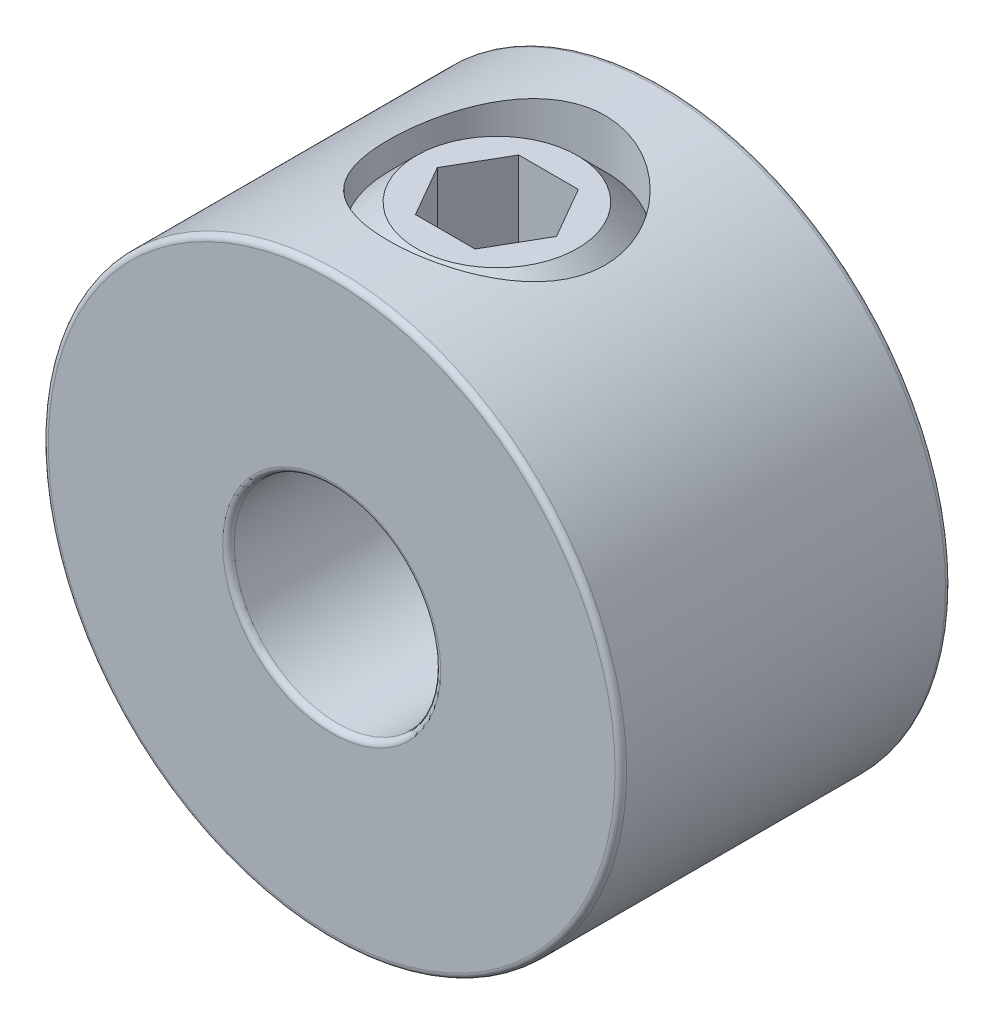
ISO-10303-21;
HEADER;
FILE_DESCRIPTION(('STEP AP214'),'2;1');
FILE_NAME('part.step','',(''),(''),'','','');
FILE_SCHEMA(('AUTOMOTIVE_DESIGN { 1 0 10303 214 1 1 1 1 }'));
ENDSEC;
DATA;
#1=APPLICATION_CONTEXT('core data for automotive mechanical design processes');
#2=APPLICATION_PROTOCOL_DEFINITION('international standard','automotive_design',2000,#1);
#3=PRODUCT_CONTEXT('',#1,'mechanical');
#4=PRODUCT('Part','Part','',(#3));
#5=PRODUCT_RELATED_PRODUCT_CATEGORY('part','',(#4));
#6=PRODUCT_DEFINITION_FORMATION('','',#4);
#7=PRODUCT_DEFINITION_CONTEXT('part definition',#1,'design');
#8=PRODUCT_DEFINITION('design','',#6,#7);
#9=PRODUCT_DEFINITION_SHAPE('','',#8);
#10=(LENGTH_UNIT() NAMED_UNIT(*) SI_UNIT(.MILLI.,.METRE.));
#11=(NAMED_UNIT(*) PLANE_ANGLE_UNIT() SI_UNIT($,.RADIAN.));
#12=(NAMED_UNIT(*) SI_UNIT($,.STERADIAN.) SOLID_ANGLE_UNIT());
#13=UNCERTAINTY_MEASURE_WITH_UNIT(LENGTH_MEASURE(1.E-05),#10,'distance_accuracy_value','');
#14=(GEOMETRIC_REPRESENTATION_CONTEXT(3) GLOBAL_UNCERTAINTY_ASSIGNED_CONTEXT((#13)) GLOBAL_UNIT_ASSIGNED_CONTEXT((#10,
#11,#12)) REPRESENTATION_CONTEXT('',''));
#15=CARTESIAN_POINT('',(0.,0.,0.));
#16=DIRECTION('',(0.,0.,1.));
#17=DIRECTION('',(1.,0.,0.));
#18=AXIS2_PLACEMENT_3D('',#15,#16,#17);
#19=CARTESIAN_POINT('',(0.,5.159375,0.));
#20=DIRECTION('',(0.,1.,0.));
#21=DIRECTION('',(-1.,0.,0.));
#22=AXIS2_PLACEMENT_3D('',#19,#20,#21);
#23=PLANE('',#22);
#24=CARTESIAN_POINT('',(0.,5.159375,0.));
#25=DIRECTION('',(0.,1.,0.));
#26=DIRECTION('',(-1.,0.,0.));
#27=AXIS2_PLACEMENT_3D('',#24,#25,#26);
#28=CIRCLE('',#27,1.54730253738467);
#29=CARTESIAN_POINT('',(-1.54730253738467,5.159375,0.));
#30=VERTEX_POINT('',#29);
#31=EDGE_CURVE('E12',#30,#30,#28,.T.);
#32=ORIENTED_EDGE('',*,*,#31,.T.);
#33=EDGE_LOOP('',(#32));
#34=FACE_BOUND('',#33,.T.);
#35=DIRECTION('',(1.,0.,0.));
#36=VECTOR('',#35,1.);
#37=CARTESIAN_POINT('',(-0.572839720211582,5.15937499999999,-0.992187499999998));
#38=LINE('',#37,#36);
#39=CARTESIAN_POINT('',(-0.572839720211582,5.15937499999999,-0.992187499999998));
#40=VERTEX_POINT('',#39);
#41=CARTESIAN_POINT('',(0.572839720211582,5.159375,-0.992187499999998));
#42=VERTEX_POINT('',#41);
#43=EDGE_CURVE('E112',#40,#42,#38,.T.);
#44=ORIENTED_EDGE('',*,*,#43,.T.);
#45=DIRECTION('',(0.5,0.,0.866025403784438));
#46=VECTOR('',#45,1.);
#47=CARTESIAN_POINT('',(0.572839720211582,5.15937499999999,-0.992187499999998));
#48=LINE('',#47,#46);
#49=CARTESIAN_POINT('',(1.14567944042316,5.15937499999999,0.));
#50=VERTEX_POINT('',#49);
#51=EDGE_CURVE('E58',#42,#50,#48,.T.);
#52=ORIENTED_EDGE('',*,*,#51,.T.);
#53=DIRECTION('',(-0.5,0.,0.866025403784439));
#54=VECTOR('',#53,1.);
#55=CARTESIAN_POINT('',(1.14567944042316,5.15937499999999,0.));
#56=LINE('',#55,#54);
#57=CARTESIAN_POINT('',(0.572839720211582,5.15937499999999,0.992187500000003));
#58=VERTEX_POINT('',#57);
#59=EDGE_CURVE('E116',#50,#58,#56,.T.);
#60=ORIENTED_EDGE('',*,*,#59,.T.);
#61=DIRECTION('',(-1.,0.,0.));
#62=VECTOR('',#61,1.);
#63=CARTESIAN_POINT('',(0.572839720211582,5.15937499999999,0.992187500000003));
#64=LINE('',#63,#62);
#65=CARTESIAN_POINT('',(-0.572839720211583,5.15937499999999,0.992187500000003));
#66=VERTEX_POINT('',#65);
#67=EDGE_CURVE('E179',#58,#66,#64,.T.);
#68=ORIENTED_EDGE('',*,*,#67,.T.);
#69=DIRECTION('',(-0.5,0.,-0.866025403784438));
#70=VECTOR('',#69,1.);
#71=CARTESIAN_POINT('',(-0.572839720211583,5.15937499999999,0.992187500000003));
#72=LINE('',#71,#70);
#73=CARTESIAN_POINT('',(-1.14567944042316,5.15937499999999,0.));
#74=VERTEX_POINT('',#73);
#75=EDGE_CURVE('E164',#66,#74,#72,.T.);
#76=ORIENTED_EDGE('',*,*,#75,.T.);
#77=DIRECTION('',(0.5,0.,-0.866025403784439));
#78=VECTOR('',#77,1.);
#79=CARTESIAN_POINT('',(-1.14567944042316,5.15937499999999,0.));
#80=LINE('',#79,#78);
#81=EDGE_CURVE('E160',#74,#40,#80,.T.);
#82=ORIENTED_EDGE('',*,*,#81,.T.);
#83=EDGE_LOOP('',(#44,#52,#60,#68,#76,#82));
#84=FACE_BOUND('',#83,.T.);
#85=ADVANCED_FACE('F44',(#34,#84),#23,.T.);
#86=CARTESIAN_POINT('',(0.,5.159375,0.));
#87=DIRECTION('',(0.,-1.,0.));
#88=DIRECTION('',(1.,0.,0.));
#89=AXIS2_PLACEMENT_3D('',#86,#87,#88);
#90=CONICAL_SURFACE('',#89,1.54730253738467,0.785398163397448);
#91=CARTESIAN_POINT('',(0.,4.62387753738467,0.));
#92=DIRECTION('',(0.,1.,0.));
#93=DIRECTION('',(-1.,0.,0.));
#94=AXIS2_PLACEMENT_3D('',#91,#92,#93);
#95=CIRCLE('',#94,2.0828);
#96=CARTESIAN_POINT('',(-2.0828,4.62387753738467,0.));
#97=VERTEX_POINT('',#96);
#98=EDGE_CURVE('E51',#97,#97,#95,.T.);
#99=ORIENTED_EDGE('',*,*,#98,.T.);
#100=EDGE_LOOP('',(#99));
#101=FACE_BOUND('',#100,.T.);
#102=ORIENTED_EDGE('',*,*,#31,.F.);
#103=EDGE_LOOP('',(#102));
#104=FACE_BOUND('',#103,.T.);
#105=ADVANCED_FACE('F134',(#101,#104),#90,.T.);
#106=CARTESIAN_POINT('',(0.,1.984375,0.));
#107=DIRECTION('',(0.,1.,0.));
#108=DIRECTION('',(-1.,0.,0.));
#109=AXIS2_PLACEMENT_3D('',#106,#107,#108);
#110=CYLINDRICAL_SURFACE('',#109,2.0828);
#111=CARTESIAN_POINT('',(0.,2.51987246261534,0.));
#112=DIRECTION('',(0.,1.,0.));
#113=DIRECTION('',(-1.,0.,0.));
#114=AXIS2_PLACEMENT_3D('',#111,#112,#113);
#115=CIRCLE('',#114,2.0828);
#116=CARTESIAN_POINT('',(-2.0828,2.51987246261534,0.));
#117=VERTEX_POINT('',#116);
#118=EDGE_CURVE('E129',#117,#117,#115,.T.);
#119=ORIENTED_EDGE('',*,*,#118,.T.);
#120=EDGE_LOOP('',(#119));
#121=FACE_BOUND('',#120,.T.);
#122=ORIENTED_EDGE('',*,*,#98,.F.);
#123=EDGE_LOOP('',(#122));
#124=FACE_BOUND('',#123,.T.);
#125=ADVANCED_FACE('F137',(#121,#124),#110,.T.);
#126=CARTESIAN_POINT('',(0.,2.51987246261534,0.));
#127=DIRECTION('',(0.,1.,0.));
#128=DIRECTION('',(-1.,0.,0.));
#129=AXIS2_PLACEMENT_3D('',#126,#127,#128);
#130=CONICAL_SURFACE('',#129,2.0828,0.785398163397448);
#131=CARTESIAN_POINT('',(0.,1.984375,0.));
#132=DIRECTION('',(0.,1.,0.));
#133=DIRECTION('',(-1.,0.,0.));
#134=AXIS2_PLACEMENT_3D('',#131,#132,#133);
#135=CIRCLE('',#134,1.54730253738467);
#136=CARTESIAN_POINT('',(-1.54730253738467,1.984375,0.));
#137=VERTEX_POINT('',#136);
#138=EDGE_CURVE('E121',#137,#137,#135,.T.);
#139=ORIENTED_EDGE('',*,*,#138,.T.);
#140=EDGE_LOOP('',(#139));
#141=FACE_BOUND('',#140,.T.);
#142=ORIENTED_EDGE('',*,*,#118,.F.);
#143=EDGE_LOOP('',(#142));
#144=FACE_BOUND('',#143,.T.);
#145=ADVANCED_FACE('F139',(#141,#144),#130,.T.);
#146=CARTESIAN_POINT('',(-1.54730253738467,1.984375,0.));
#147=DIRECTION('',(0.,-1.,0.));
#148=DIRECTION('',(1.,0.,0.));
#149=AXIS2_PLACEMENT_3D('',#146,#147,#148);
#150=PLANE('',#149);
#151=CARTESIAN_POINT('',(0.,1.984375,0.));
#152=DIRECTION('',(0.,1.,0.));
#153=DIRECTION('',(-1.,0.,0.));
#154=AXIS2_PLACEMENT_3D('',#151,#152,#153);
#155=CIRCLE('',#154,0.642596955138402);
#156=CARTESIAN_POINT('',(-0.642596955138402,1.984375,0.));
#157=VERTEX_POINT('',#156);
#158=EDGE_CURVE('E117',#157,#157,#155,.T.);
#159=ORIENTED_EDGE('',*,*,#158,.T.);
#160=EDGE_LOOP('',(#159));
#161=FACE_BOUND('',#160,.T.);
#162=ORIENTED_EDGE('',*,*,#138,.F.);
#163=EDGE_LOOP('',(#162));
#164=FACE_BOUND('',#163,.T.);
#165=ADVANCED_FACE('F146',(#161,#164),#150,.T.);
#166=CARTESIAN_POINT('',(0.,1.984375,0.));
#167=DIRECTION('',(0.,-1.,0.));
#168=DIRECTION('',(1.,0.,0.));
#169=AXIS2_PLACEMENT_3D('',#166,#167,#168);
#170=CONICAL_SURFACE('',#169,0.642596955138402,0.785398163397448);
#171=CARTESIAN_POINT('',(0.,2.6269719551384,0.));
#172=VERTEX_POINT('',#171);
#173=VERTEX_LOOP('',#172);
#174=FACE_BOUND('',#173,.T.);
#175=ORIENTED_EDGE('',*,*,#158,.F.);
#176=EDGE_LOOP('',(#175));
#177=FACE_BOUND('',#176,.T.);
#178=ADVANCED_FACE('F213',(#174,#177),#170,.F.);
#179=CARTESIAN_POINT('',(0.572839720211582,3.17499999999999,-0.992187499999998));
#180=DIRECTION('',(-0.866025403784438,0.,0.5));
#181=DIRECTION('',(0.5,0.,0.866025403784439));
#182=AXIS2_PLACEMENT_3D('',#179,#180,#181);
#183=PLANE('',#182);
#184=ORIENTED_EDGE('',*,*,#51,.F.);
#185=DIRECTION('',(0.,1.,0.));
#186=VECTOR('',#185,1.);
#187=CARTESIAN_POINT('',(0.572839720211582,3.17499999999999,-0.992187499999998));
#188=LINE('',#187,#186);
#189=CARTESIAN_POINT('',(0.572839720211582,3.17499999999999,-0.992187499999998));
#190=VERTEX_POINT('',#189);
#191=EDGE_CURVE('E111',#190,#42,#188,.T.);
#192=ORIENTED_EDGE('',*,*,#191,.F.);
#193=DIRECTION('',(0.5,0.,0.866025403784438));
#194=VECTOR('',#193,1.);
#195=CARTESIAN_POINT('',(0.572839720211582,3.17499999999999,-0.992187499999998));
#196=LINE('',#195,#194);
#197=CARTESIAN_POINT('',(1.14567944042316,3.17499999999999,0.));
#198=VERTEX_POINT('',#197);
#199=EDGE_CURVE('E102',#190,#198,#196,.T.);
#200=ORIENTED_EDGE('',*,*,#199,.T.);
#201=DIRECTION('',(0.,1.,0.));
#202=VECTOR('',#201,1.);
#203=CARTESIAN_POINT('',(1.14567944042316,3.17499999999999,0.));
#204=LINE('',#203,#202);
#205=EDGE_CURVE('E110',#198,#50,#204,.T.);
#206=ORIENTED_EDGE('',*,*,#205,.T.);
#207=EDGE_LOOP('',(#184,#192,#200,#206));
#208=FACE_BOUND('',#207,.T.);
#209=ADVANCED_FACE('F109',(#208),#183,.T.);
#210=CARTESIAN_POINT('',(1.14567944042316,3.17499999999999,0.));
#211=DIRECTION('',(-0.866025403784439,0.,-0.499999999999999));
#212=DIRECTION('',(-0.5,0.,0.866025403784439));
#213=AXIS2_PLACEMENT_3D('',#210,#211,#212);
#214=PLANE('',#213);
#215=ORIENTED_EDGE('',*,*,#59,.F.);
#216=ORIENTED_EDGE('',*,*,#205,.F.);
#217=DIRECTION('',(-0.5,0.,0.866025403784439));
#218=VECTOR('',#217,1.);
#219=CARTESIAN_POINT('',(1.14567944042316,3.17499999999999,0.));
#220=LINE('',#219,#218);
#221=CARTESIAN_POINT('',(0.572839720211582,3.17499999999999,0.992187500000003));
#222=VERTEX_POINT('',#221);
#223=EDGE_CURVE('E98',#198,#222,#220,.T.);
#224=ORIENTED_EDGE('',*,*,#223,.T.);
#225=DIRECTION('',(0.,1.,0.));
#226=VECTOR('',#225,1.);
#227=CARTESIAN_POINT('',(0.572839720211582,3.17499999999999,0.992187500000003));
#228=LINE('',#227,#226);
#229=EDGE_CURVE('E118',#222,#58,#228,.T.);
#230=ORIENTED_EDGE('',*,*,#229,.T.);
#231=EDGE_LOOP('',(#215,#216,#224,#230));
#232=FACE_BOUND('',#231,.T.);
#233=ADVANCED_FACE('F114',(#232),#214,.T.);
#234=CARTESIAN_POINT('',(0.572839720211582,3.17499999999999,0.992187500000003));
#235=DIRECTION('',(0.,0.,-1.));
#236=DIRECTION('',(-1.,0.,0.));
#237=AXIS2_PLACEMENT_3D('',#234,#235,#236);
#238=PLANE('',#237);
#239=ORIENTED_EDGE('',*,*,#67,.F.);
#240=ORIENTED_EDGE('',*,*,#229,.F.);
#241=DIRECTION('',(-1.,0.,0.));
#242=VECTOR('',#241,1.);
#243=CARTESIAN_POINT('',(0.572839720211582,3.17499999999999,0.992187500000003));
#244=LINE('',#243,#242);
#245=CARTESIAN_POINT('',(-0.572839720211583,3.17499999999999,0.992187500000003));
#246=VERTEX_POINT('',#245);
#247=EDGE_CURVE('E104',#222,#246,#244,.T.);
#248=ORIENTED_EDGE('',*,*,#247,.T.);
#249=DIRECTION('',(0.,1.,0.));
#250=VECTOR('',#249,1.);
#251=CARTESIAN_POINT('',(-0.572839720211583,3.17499999999999,0.992187500000003));
#252=LINE('',#251,#250);
#253=EDGE_CURVE('E123',#246,#66,#252,.T.);
#254=ORIENTED_EDGE('',*,*,#253,.T.);
#255=EDGE_LOOP('',(#239,#240,#248,#254));
#256=FACE_BOUND('',#255,.T.);
#257=ADVANCED_FACE('F177',(#256),#238,.T.);
#258=CARTESIAN_POINT('',(-0.572839720211583,3.17499999999999,0.992187500000003));
#259=DIRECTION('',(0.866025403784438,0.,-0.5));
#260=DIRECTION('',(-0.5,0.,-0.866025403784439));
#261=AXIS2_PLACEMENT_3D('',#258,#259,#260);
#262=PLANE('',#261);
#263=ORIENTED_EDGE('',*,*,#75,.F.);
#264=ORIENTED_EDGE('',*,*,#253,.F.);
#265=DIRECTION('',(-0.5,0.,-0.866025403784438));
#266=VECTOR('',#265,1.);
#267=CARTESIAN_POINT('',(-0.572839720211583,3.17499999999999,0.992187500000003));
#268=LINE('',#267,#266);
#269=CARTESIAN_POINT('',(-1.14567944042316,3.17499999999999,0.));
#270=VERTEX_POINT('',#269);
#271=EDGE_CURVE('E190',#246,#270,#268,.T.);
#272=ORIENTED_EDGE('',*,*,#271,.T.);
#273=DIRECTION('',(0.,1.,0.));
#274=VECTOR('',#273,1.);
#275=CARTESIAN_POINT('',(-1.14567944042316,3.17499999999999,0.));
#276=LINE('',#275,#274);
#277=EDGE_CURVE('E172',#270,#74,#276,.T.);
#278=ORIENTED_EDGE('',*,*,#277,.T.);
#279=EDGE_LOOP('',(#263,#264,#272,#278));
#280=FACE_BOUND('',#279,.T.);
#281=ADVANCED_FACE('F181',(#280),#262,.T.);
#282=CARTESIAN_POINT('',(-1.14567944042316,3.17499999999999,0.));
#283=DIRECTION('',(0.866025403784439,0.,0.5));
#284=DIRECTION('',(0.5,0.,-0.866025403784439));
#285=AXIS2_PLACEMENT_3D('',#282,#283,#284);
#286=PLANE('',#285);
#287=ORIENTED_EDGE('',*,*,#81,.F.);
#288=ORIENTED_EDGE('',*,*,#277,.F.);
#289=DIRECTION('',(0.5,0.,-0.866025403784439));
#290=VECTOR('',#289,1.);
#291=CARTESIAN_POINT('',(-1.14567944042316,3.17499999999999,0.));
#292=LINE('',#291,#290);
#293=CARTESIAN_POINT('',(-0.572839720211582,3.17499999999999,-0.992187499999998));
#294=VERTEX_POINT('',#293);
#295=EDGE_CURVE('E188',#270,#294,#292,.T.);
#296=ORIENTED_EDGE('',*,*,#295,.T.);
#297=DIRECTION('',(0.,1.,0.));
#298=VECTOR('',#297,1.);
#299=CARTESIAN_POINT('',(-0.572839720211582,3.17499999999999,-0.992187499999998));
#300=LINE('',#299,#298);
#301=EDGE_CURVE('E169',#294,#40,#300,.T.);
#302=ORIENTED_EDGE('',*,*,#301,.T.);
#303=EDGE_LOOP('',(#287,#288,#296,#302));
#304=FACE_BOUND('',#303,.T.);
#305=ADVANCED_FACE('F194',(#304),#286,.T.);
#306=CARTESIAN_POINT('',(-0.572839720211582,3.17499999999999,-0.992187499999998));
#307=DIRECTION('',(0.,0.,1.));
#308=DIRECTION('',(1.,0.,0.));
#309=AXIS2_PLACEMENT_3D('',#306,#307,#308);
#310=PLANE('',#309);
#311=ORIENTED_EDGE('',*,*,#43,.F.);
#312=ORIENTED_EDGE('',*,*,#301,.F.);
#313=DIRECTION('',(1.,0.,0.));
#314=VECTOR('',#313,1.);
#315=CARTESIAN_POINT('',(-0.572839720211582,3.17499999999999,-0.992187499999998));
#316=LINE('',#315,#314);
#317=EDGE_CURVE('E170',#294,#190,#316,.T.);
#318=ORIENTED_EDGE('',*,*,#317,.T.);
#319=ORIENTED_EDGE('',*,*,#191,.T.);
#320=EDGE_LOOP('',(#311,#312,#318,#319));
#321=FACE_BOUND('',#320,.T.);
#322=ADVANCED_FACE('F195',(#321),#310,.T.);
#323=CARTESIAN_POINT('',(0.,3.17499999999999,-1.984375));
#324=DIRECTION('',(0.,1.,0.));
#325=DIRECTION('',(0.,0.,1.));
#326=AXIS2_PLACEMENT_3D('',#323,#324,#325);
#327=PLANE('',#326);
#328=ORIENTED_EDGE('',*,*,#199,.F.);
#329=ORIENTED_EDGE('',*,*,#317,.F.);
#330=ORIENTED_EDGE('',*,*,#295,.F.);
#331=ORIENTED_EDGE('',*,*,#271,.F.);
#332=ORIENTED_EDGE('',*,*,#247,.F.);
#333=ORIENTED_EDGE('',*,*,#223,.F.);
#334=EDGE_LOOP('',(#328,#329,#330,#331,#332,#333));
#335=FACE_BOUND('',#334,.T.);
#336=ADVANCED_FACE('F100',(#335),#327,.T.);
#337=CLOSED_SHELL('',(#85,#105,#125,#145,#165,#178,#209,#233,#257,#281,#305,#322,#336));
#338=MANIFOLD_SOLID_BREP('B2',#337);
#339=CARTESIAN_POINT('',(0.,0.,3.175));
#340=DIRECTION('',(0.,0.,1.));
#341=DIRECTION('',(1.,0.,0.));
#342=AXIS2_PLACEMENT_3D('',#339,#340,#341);
#343=PLANE('',#342);
#344=CARTESIAN_POINT('',(0.,0.,3.175));
#345=DIRECTION('',(0.,0.,1.));
#346=DIRECTION('',(1.,0.,0.));
#347=AXIS2_PLACEMENT_3D('',#344,#345,#346);
#348=CIRCLE('',#347,2.0955);
#349=CARTESIAN_POINT('',(2.0955,0.,3.175));
#350=VERTEX_POINT('',#349);
#351=EDGE_CURVE('E397',#350,#350,#348,.F.);
#352=ORIENTED_EDGE('',*,*,#351,.T.);
#353=EDGE_LOOP('',(#352));
#354=FACE_BOUND('',#353,.T.);
#355=CARTESIAN_POINT('',(0.,0.,3.175));
#356=DIRECTION('',(0.,0.,1.));
#357=DIRECTION('',(1.,0.,0.));
#358=AXIS2_PLACEMENT_3D('',#355,#356,#357);
#359=CIRCLE('',#358,5.445125);
#360=CARTESIAN_POINT('',(5.445125,0.,3.175));
#361=VERTEX_POINT('',#360);
#362=EDGE_CURVE('E400',#361,#361,#359,.T.);
#363=ORIENTED_EDGE('',*,*,#362,.T.);
#364=EDGE_LOOP('',(#363));
#365=FACE_BOUND('',#364,.T.);
#366=ADVANCED_FACE('F298',(#354,#365),#343,.T.);
#367=CARTESIAN_POINT('',(0.,0.,-3.175));
#368=DIRECTION('',(0.,0.,1.));
#369=DIRECTION('',(1.,0.,0.));
#370=AXIS2_PLACEMENT_3D('',#367,#368,#369);
#371=PLANE('',#370);
#372=CARTESIAN_POINT('',(0.,0.,-3.175));
#373=DIRECTION('',(0.,0.,1.));
#374=DIRECTION('',(1.,0.,0.));
#375=AXIS2_PLACEMENT_3D('',#372,#373,#374);
#376=CIRCLE('',#375,2.0955);
#377=CARTESIAN_POINT('',(2.0955,0.,-3.175));
#378=VERTEX_POINT('',#377);
#379=EDGE_CURVE('E416',#378,#378,#376,.T.);
#380=ORIENTED_EDGE('',*,*,#379,.T.);
#381=EDGE_LOOP('',(#380));
#382=FACE_BOUND('',#381,.T.);
#383=CARTESIAN_POINT('',(0.,0.,-3.175));
#384=DIRECTION('',(0.,0.,1.));
#385=DIRECTION('',(1.,0.,0.));
#386=AXIS2_PLACEMENT_3D('',#383,#384,#385);
#387=CIRCLE('',#386,5.445125);
#388=CARTESIAN_POINT('',(5.445125,0.,-3.175));
#389=VERTEX_POINT('',#388);
#390=EDGE_CURVE('E419',#389,#389,#387,.F.);
#391=ORIENTED_EDGE('',*,*,#390,.T.);
#392=EDGE_LOOP('',(#391));
#393=FACE_BOUND('',#392,.T.);
#394=ADVANCED_FACE('F370',(#382,#393),#371,.F.);
#395=CARTESIAN_POINT('',(0.,0.,3.175));
#396=DIRECTION('',(0.,0.,-1.));
#397=DIRECTION('',(-1.,0.,0.));
#398=AXIS2_PLACEMENT_3D('',#395,#396,#397);
#399=CYLINDRICAL_SURFACE('',#398,5.55625);
#400=CARTESIAN_POINT('',(0.,0.,-3.063875));
#401=DIRECTION('',(0.,0.,1.));
#402=DIRECTION('',(1.,0.,0.));
#403=AXIS2_PLACEMENT_3D('',#400,#401,#402);
#404=CIRCLE('',#403,5.55625);
#405=CARTESIAN_POINT('',(5.55625,0.,-3.063875));
#406=VERTEX_POINT('',#405);
#407=EDGE_CURVE('E42',#406,#406,#404,.T.);
#408=ORIENTED_EDGE('',*,*,#407,.T.);
#409=EDGE_LOOP('',(#408));
#410=FACE_BOUND('',#409,.T.);
#411=CARTESIAN_POINT('',(0.,0.,3.063875));
#412=DIRECTION('',(0.,0.,1.));
#413=DIRECTION('',(1.,0.,0.));
#414=AXIS2_PLACEMENT_3D('',#411,#412,#413);
#415=CIRCLE('',#414,5.55625);
#416=CARTESIAN_POINT('',(5.55625,0.,3.063875));
#417=VERTEX_POINT('',#416);
#418=EDGE_CURVE('E306',#417,#417,#415,.F.);
#419=ORIENTED_EDGE('',*,*,#418,.T.);
#420=EDGE_LOOP('',(#419));
#421=FACE_BOUND('',#420,.T.);
#422=CARTESIAN_POINT('',(0.,5.55625,-2.0828));
#423=CARTESIAN_POINT('',(0.112800632930004,5.55625300768121,-2.08280401535049));
#424=CARTESIAN_POINT('',(0.22557375650504,5.55278505962081,-2.07360774080138));
#425=CARTESIAN_POINT('',(0.447749891057454,5.5392973200522,-2.03721439435715));
#426=CARTESIAN_POINT('',(0.55715338230433,5.5292784668036,-2.0100199002673));
#427=CARTESIAN_POINT('',(0.7693540019046,5.50376437690656,-1.93872693071781));
#428=CARTESIAN_POINT('',(0.872163424064122,5.48827970334317,-1.89466104660532));
#429=CARTESIAN_POINT('',(1.06892323856479,5.4533764248173,-1.79104186225435));
#430=CARTESIAN_POINT('',(1.16287124747356,5.43395676586827,-1.73148441138188));
#431=CARTESIAN_POINT('',(1.34322911463978,5.39226740506348,-1.59593235187956));
#432=CARTESIAN_POINT('',(1.42921302733438,5.36991708646606,-1.51939602956842));
#433=CARTESIAN_POINT('',(1.58746804313499,5.3252823776817,-1.35320883055734));
#434=CARTESIAN_POINT('',(1.65973495359077,5.30299800969504,-1.26355395890717));
#435=CARTESIAN_POINT('',(1.79121226481723,5.26008047465291,-1.06951383102155));
#436=CARTESIAN_POINT('',(1.84982111942716,5.23954242039672,-0.964697836024094));
#437=CARTESIAN_POINT('',(1.94838923392661,5.20369722833776,-0.745805447537557));
#438=CARTESIAN_POINT('',(1.98835593632194,5.18838800368424,-0.631732770982777));
#439=CARTESIAN_POINT('',(2.04682402169344,5.16559576084147,-0.402467790242334));
#440=CARTESIAN_POINT('',(2.06613822134155,5.15781763095547,-0.287513102391948));
#441=CARTESIAN_POINT('',(2.08529440426013,5.15010472983807,-0.0557514095444379));
#442=CARTESIAN_POINT('',(2.08514442146683,5.15016672255756,0.0610548113178707));
#443=CARTESIAN_POINT('',(2.06599808773832,5.15787259600182,0.285767992124775));
#444=CARTESIAN_POINT('',(2.04812917392808,5.16506290320801,0.393789454265148));
#445=CARTESIAN_POINT('',(1.99591596349076,5.18546148958707,0.605171149502855));
#446=CARTESIAN_POINT('',(1.96156918768862,5.19867067431454,0.708530678628621));
#447=CARTESIAN_POINT('',(1.87675563584502,5.2298919804838,0.909953267713995));
#448=CARTESIAN_POINT('',(1.82599630573539,5.24799020400401,1.00787920704196));
#449=CARTESIAN_POINT('',(1.71000247451572,5.28692170218376,1.19415076370434));
#450=CARTESIAN_POINT('',(1.64476297834093,5.3077559196341,1.28249305937992));
#451=CARTESIAN_POINT('',(1.4965021407131,5.35151860221495,1.45333045485081));
#452=CARTESIAN_POINT('',(1.41258090144428,5.37449375049466,1.53503453035891));
#453=CARTESIAN_POINT('',(1.23196365426747,5.41874674251992,1.68344452863914));
#454=CARTESIAN_POINT('',(1.1352656895903,5.44002432547937,1.75014814983905));
#455=CARTESIAN_POINT('',(0.929823331313823,5.47890719997606,1.86753532666365));
#456=CARTESIAN_POINT('',(0.820915981682845,5.49645071347302,1.91795560812022));
#457=CARTESIAN_POINT('',(0.595343579335006,5.52543048412729,1.99949665444985));
#458=CARTESIAN_POINT('',(0.478681994972036,5.53686945135909,2.03062598440935));
#459=CARTESIAN_POINT('',(0.247570187168623,5.5518749936626,2.07118115087403));
#460=CARTESIAN_POINT('',(0.133331773827584,5.55582753103965,2.08167220007853));
#461=CARTESIAN_POINT('',(-0.0953283436577317,5.55660748535906,2.083754441011));
#462=CARTESIAN_POINT('',(-0.209750001589684,5.55343648058412,2.07534981923885));
#463=CARTESIAN_POINT('',(-0.430926540416132,5.54058024960133,2.04068898213469));
#464=CARTESIAN_POINT('',(-0.537807116159227,5.53114977163135,2.01513045938022));
#465=CARTESIAN_POINT('',(-0.745687864829837,5.50697945787875,1.94780582513564));
#466=CARTESIAN_POINT('',(-0.846687270958335,5.49223893155362,1.90603760560919));
#467=CARTESIAN_POINT('',(-1.04326337793135,5.45836614698944,1.80614776949349));
#468=CARTESIAN_POINT('',(-1.13859364241543,5.43911760327552,1.74758182189689));
#469=CARTESIAN_POINT('',(-1.31839271067494,5.39835785558102,1.61626143061731));
#470=CARTESIAN_POINT('',(-1.40285748760972,5.37684581806946,1.54350175161408));
#471=CARTESIAN_POINT('',(-1.5636497571678,5.33237981787699,1.3808954905382));
#472=CARTESIAN_POINT('',(-1.63922162799222,5.30941456183645,1.2903028632398));
#473=CARTESIAN_POINT('',(-1.77423955261877,5.26583668916757,1.09727040858404));
#474=CARTESIAN_POINT('',(-1.83368416430154,5.24522428302937,0.994829522908312));
#475=CARTESIAN_POINT('',(-1.93481923474378,5.2087720132518,0.780165029958659));
#476=CARTESIAN_POINT('',(-1.97643552425905,5.19295216591895,0.667902850327276));
#477=CARTESIAN_POINT('',(-2.03990093033916,5.16835555583759,0.437205681476789));
#478=CARTESIAN_POINT('',(-2.06176226343082,5.15957444069517,0.318774555150432));
#479=CARTESIAN_POINT('',(-2.08400604935767,5.15062742767764,0.0872883285335795));
#480=CARTESIAN_POINT('',(-2.08567688417979,5.14994480894648,-0.0256240229937523));
#481=CARTESIAN_POINT('',(-2.07079252565419,5.15594759760087,-0.250030481291804));
#482=CARTESIAN_POINT('',(-2.05423905778867,5.16263230744571,-0.361524721318785));
#483=CARTESIAN_POINT('',(-2.0043787434665,5.1821866620233,-0.576481637548906));
#484=CARTESIAN_POINT('',(-1.97159779594338,5.19486162518906,-0.68008552574187));
#485=CARTESIAN_POINT('',(-1.89067616429862,5.22485507472632,-0.880383384458793));
#486=CARTESIAN_POINT('',(-1.84253159866192,5.24217473437253,-0.97707560123107));
#487=CARTESIAN_POINT('',(-1.72932228141872,5.28063498027688,-1.16631306072801));
#488=CARTESIAN_POINT('',(-1.6635032144585,5.30192820905341,-1.25837563942295));
#489=CARTESIAN_POINT('',(-1.51798138023012,5.34541005082352,-1.43056079319698));
#490=CARTESIAN_POINT('',(-1.43827420211132,5.36759894655465,-1.51067955988693));
#491=CARTESIAN_POINT('',(-1.26208849099773,5.41181284852435,-1.66111819025951));
#492=CARTESIAN_POINT('',(-1.16493627252017,5.43376415796984,-1.73067424974454));
#493=CARTESIAN_POINT('',(-0.959551270436361,5.47376576077515,-1.85244953260773));
#494=CARTESIAN_POINT('',(-0.851317639554694,5.491815755515,-1.90466742902754));
#495=CARTESIAN_POINT('',(-0.62186338385069,5.5226027657999,-1.99173944958096));
#496=CARTESIAN_POINT('',(-0.500284487091534,5.53507803240463,-2.02575064676068));
#497=CARTESIAN_POINT('',(-0.252457334192373,5.55189793213197,-2.07127304477625));
#498=CARTESIAN_POINT('',(-0.126211447425829,5.55624663473698,-2.08279550726637));
#499=CARTESIAN_POINT('',(0.,5.55625,-2.0828));
#500=B_SPLINE_CURVE_WITH_KNOTS('',3,(#422,#423,#424,#425,#426,#427,#428,#429,#430,#431,#432,
#433,#434,#435,#436,#437,#438,#439,#440,#441,#442,#443,#444,#445,#446,#447,#448,#449,#450,#451,
#452,#453,#454,#455,#456,#457,#458,#459,#460,#461,#462,#463,#464,#465,#466,#467,#468,#469,#470,
#471,#472,#473,#474,#475,#476,#477,#478,#479,#480,#481,#482,#483,#484,#485,#486,#487,#488,#489,
#490,#491,#492,#493,#494,#495,#496,#497,#498,#499),.UNSPECIFIED.,.T.,.F.,(4,2,2,2,2,2,2,2,2,2,2,
2,2,2,2,2,2,2,2,2,2,2,2,2,2,2,2,2,2,2,2,2,2,2,2,2,2,2,4),(0.,0.337936375735737,
0.675824360812358,1.01306289665027,1.35039188157959,1.70062735361547,2.05096970458192,
2.41464480516559,2.77817459121935,3.12680120299707,3.47528391789854,3.80292943607457,
4.13062426559094,4.46451595605232,4.7985230049902,5.15495935990809,5.51145036684649,
5.87344604132048,6.23528087614685,6.57789186152055,6.92042694593843,7.24981241891747,
7.57924074213389,7.91834581789554,8.25757620897215,8.6164728789594,8.97540163135854,
9.33580942789548,9.6959941942964,10.0330639252718,10.3701017451327,10.6968689808505,
11.023718837565,11.3676926275184,11.7117758630099,12.0744589282967,12.4371697447618,
12.8154727091034,13.1935861825084),.UNSPECIFIED.);
#501=CARTESIAN_POINT('',(0.,5.55625,-2.0828));
#502=VERTEX_POINT('',#501);
#503=EDGE_CURVE('E332',#502,#502,#500,.T.);
#504=ORIENTED_EDGE('',*,*,#503,.T.);
#505=EDGE_LOOP('',(#504));
#506=FACE_BOUND('',#505,.T.);
#507=ADVANCED_FACE('F365',(#410,#421,#506),#399,.T.);
#508=CARTESIAN_POINT('',(0.,0.,3.175));
#509=DIRECTION('',(0.,0.,-1.));
#510=DIRECTION('',(-1.,0.,0.));
#511=AXIS2_PLACEMENT_3D('',#508,#509,#510);
#512=CYLINDRICAL_SURFACE('',#511,1.984375);
#513=CARTESIAN_POINT('',(0.,0.,-3.063875));
#514=DIRECTION('',(0.,0.,1.));
#515=DIRECTION('',(1.,0.,0.));
#516=AXIS2_PLACEMENT_3D('',#513,#514,#515);
#517=CIRCLE('',#516,1.984375);
#518=CARTESIAN_POINT('',(1.984375,0.,-3.063875));
#519=VERTEX_POINT('',#518);
#520=EDGE_CURVE('E402',#519,#519,#517,.F.);
#521=ORIENTED_EDGE('',*,*,#520,.T.);
#522=EDGE_LOOP('',(#521));
#523=FACE_BOUND('',#522,.T.);
#524=CARTESIAN_POINT('',(0.,0.,3.063875));
#525=DIRECTION('',(0.,0.,1.));
#526=DIRECTION('',(1.,0.,0.));
#527=AXIS2_PLACEMENT_3D('',#524,#525,#526);
#528=CIRCLE('',#527,1.984375);
#529=CARTESIAN_POINT('',(1.984375,0.,3.063875));
#530=VERTEX_POINT('',#529);
#531=EDGE_CURVE('E406',#530,#530,#528,.T.);
#532=ORIENTED_EDGE('',*,*,#531,.T.);
#533=EDGE_LOOP('',(#532));
#534=FACE_BOUND('',#533,.T.);
#535=DIRECTION('',(0.,0.,-1.));
#536=VECTOR('',#535,1.);
#537=CARTESIAN_POINT('',(-1.984375,0.,3.175));
#538=LINE('',#537,#536);
#539=CARTESIAN_POINT('',(-1.984375,0.,0.632701904039342));
#540=VERTEX_POINT('',#539);
#541=CARTESIAN_POINT('',(-1.984375,0.,-0.632701904039337));
#542=VERTEX_POINT('',#541);
#543=EDGE_CURVE('E319',#540,#542,#538,.T.);
#544=ORIENTED_EDGE('',*,*,#543,.F.);
#545=CARTESIAN_POINT('',(1.984375,0.,0.632701904039342));
#546=CARTESIAN_POINT('',(1.98440472234411,0.0407426465235362,0.632515127197594));
#547=CARTESIAN_POINT('',(1.98312331583581,0.0811525372377342,0.636640894741571));
#548=CARTESIAN_POINT('',(1.97830389981352,0.159830795477807,0.65150377602454));
#549=CARTESIAN_POINT('',(1.97481036825063,0.198125553640917,0.662110438041443));
#550=CARTESIAN_POINT('',(1.963114609447,0.29615387407901,0.696203388226041));
#551=CARTESIAN_POINT('',(1.95333323786676,0.354258387472256,0.723595151963264));
#552=CARTESIAN_POINT('',(1.92957187396849,0.466731803220427,0.784805298719722));
#553=CARTESIAN_POINT('',(1.91553991125054,0.521043593833175,0.818701208974432));
#554=CARTESIAN_POINT('',(1.88098479409992,0.635443976561054,0.895552770256167));
#555=CARTESIAN_POINT('',(1.85976300543718,0.694940157157343,0.939068038525386));
#556=CARTESIAN_POINT('',(1.81229839309759,0.810696464811727,1.02770304008434));
#557=CARTESIAN_POINT('',(1.78605037909181,0.86695316782449,1.0728243923372));
#558=CARTESIAN_POINT('',(1.72857987157554,0.976508469256767,1.16315359874349));
#559=CARTESIAN_POINT('',(1.69737089649889,1.02981459045816,1.20836089710101));
#560=CARTESIAN_POINT('',(1.62983391784219,1.13367441840772,1.29801726298618));
#561=CARTESIAN_POINT('',(1.59350872209272,1.18422961393206,1.34246673151738));
#562=CARTESIAN_POINT('',(1.48814687194739,1.31703611259936,1.46062374129299));
#563=CARTESIAN_POINT('',(1.41405439717726,1.39661049058176,1.53295393677452));
#564=CARTESIAN_POINT('',(1.24976559724912,1.5453343977061,1.66958981056126));
#565=CARTESIAN_POINT('',(1.15959525024323,1.61450041678371,1.73390815357045));
#566=CARTESIAN_POINT('',(0.987713147914299,1.72329766716226,1.83570116040883));
#567=CARTESIAN_POINT('',(0.909545774024042,1.76598647334309,1.87586343333252));
#568=CARTESIAN_POINT('',(0.744730309499341,1.84155385503855,1.94717122845254));
#569=CARTESIAN_POINT('',(0.658087032784607,1.87443795670065,1.97832182953012));
#570=CARTESIAN_POINT('',(0.477079872895758,1.92850474396855,2.02962277763324));
#571=CARTESIAN_POINT('',(0.382651321111294,1.94957503443113,2.04966744360362));
#572=CARTESIAN_POINT('',(0.189897405373077,1.9776586723722,2.07639743575544));
#573=CARTESIAN_POINT('',(0.0915762681674965,1.98468686242588,2.08309686789795));
#574=CARTESIAN_POINT('',(-0.0907012316965862,1.9840874641926,2.08252627200428));
#575=CARTESIAN_POINT('',(-0.174681125984809,1.97843017388732,2.07713426685346));
#576=CARTESIAN_POINT('',(-0.340052135419258,1.95679869266518,2.05654121989582));
#577=CARTESIAN_POINT('',(-0.421443037965628,1.94082365677049,2.04133937470649));
#578=CARTESIAN_POINT('',(-0.578493162830749,1.89989309221733,2.00246476643306));
#579=CARTESIAN_POINT('',(-0.654215777629701,1.87506398432,1.97891127585553));
#580=CARTESIAN_POINT('',(-0.799906223166461,1.81769999080444,1.92464512473653));
#581=CARTESIAN_POINT('',(-0.869872278408891,1.78516273967864,1.89393026653013));
#582=CARTESIAN_POINT('',(-1.03496978984547,1.69676653149308,1.81080230038812));
#583=CARTESIAN_POINT('',(-1.12638238110238,1.6371502484015,1.75499211488454));
#584=CARTESIAN_POINT('',(-1.2949989840926,1.50735116482535,1.63457067009069));
#585=CARTESIAN_POINT('',(-1.37215999238664,1.43713750930331,1.56993376527568));
#586=CARTESIAN_POINT('',(-1.48928794302396,1.31317837154907,1.45750300198798));
#587=CARTESIAN_POINT('',(-1.5331220242248,1.26165350254368,1.41119754026139));
#588=CARTESIAN_POINT('',(-1.61476992413718,1.15531833196936,1.3169886043915));
#589=CARTESIAN_POINT('',(-1.6525801737997,1.10050610895626,1.26908420307326));
#590=CARTESIAN_POINT('',(-1.72228865578667,0.98785136687749,1.17273555867248));
#591=CARTESIAN_POINT('',(-1.75419401405202,0.930012609806336,1.12429204206385));
#592=CARTESIAN_POINT('',(-1.81226364180759,0.811066464169349,1.02805625024238));
#593=CARTESIAN_POINT('',(-1.83843257197667,0.749961779660842,0.980263476155115));
#594=CARTESIAN_POINT('',(-1.87996778631198,0.637370118088302,0.89746050137184));
#595=CARTESIAN_POINT('',(-1.89644585447215,0.58667712277507,0.861928723398168));
#596=CARTESIAN_POINT('',(-1.92573555961468,0.481922801418117,0.794317817483001));
#597=CARTESIAN_POINT('',(-1.93854798847621,0.427862205946413,0.762237944770438));
#598=CARTESIAN_POINT('',(-1.95672675082547,0.332481027698926,0.713953012242788));
#599=CARTESIAN_POINT('',(-1.96317181638706,0.292327529260174,0.695894739710439));
#600=CARTESIAN_POINT('',(-1.97369470881233,0.209726962489296,0.66546681864503));
#601=CARTESIAN_POINT('',(-1.97778578161571,0.167294226620791,0.653065422310559));
#602=CARTESIAN_POINT('',(-1.98177068099454,0.103659820003669,0.64082636689483));
#603=CARTESIAN_POINT('',(-1.98273984353701,0.0831288058057,0.637813571829659));
#604=CARTESIAN_POINT('',(-1.98404531730802,0.0417395037017053,0.633736196558577));
#605=CARTESIAN_POINT('',(-1.98437802508323,0.020880022558974,0.632682710414096));
#606=CARTESIAN_POINT('',(-1.984375,0.,0.632701904039342));
#607=B_SPLINE_CURVE_WITH_KNOTS('',3,(#545,#546,#547,#548,#549,#550,#551,#552,#553,#554,#555,
#556,#557,#558,#559,#560,#561,#562,#563,#564,#565,#566,#567,#568,#569,#570,#571,#572,#573,#574,
#575,#576,#577,#578,#579,#580,#581,#582,#583,#584,#585,#586,#587,#588,#589,#590,#591,#592,#593,
#594,#595,#596,#597,#598,#599,#600,#601,#602,#603,#604,#605,#606),.UNSPECIFIED.,.F.,.F.,(4,2,2,
2,2,2,2,2,2,2,2,2,2,2,2,2,2,2,2,2,2,2,2,2,2,2,2,2,2,2,4),(0.,0.121475267395266,
0.240582455003286,0.434443261884956,0.63077717198529,0.860562874470086,1.09058715729966,
1.31999505127257,1.54927753106919,1.93959676322145,2.32929095159613,2.62131319917028,
2.91317054408238,3.20775941133707,3.50203673150147,3.75380756615768,4.00559902234873,
4.2539305190531,4.50233832372436,4.86805302003598,5.23485382991104,5.48050186307893,
5.7262949028431,5.97178936081079,6.21708361635129,6.40909585876814,6.60106658987135,
6.73426117012206,6.86669874314562,6.92892340836582,6.99149934383607),.UNSPECIFIED.);
#608=CARTESIAN_POINT('',(1.984375,0.,0.632701904039342));
#609=VERTEX_POINT('',#608);
#610=EDGE_CURVE('E331',#609,#540,#607,.T.);
#611=ORIENTED_EDGE('',*,*,#610,.F.);
#612=DIRECTION('',(0.,0.,-1.));
#613=VECTOR('',#612,1.);
#614=CARTESIAN_POINT('',(1.984375,0.,3.175));
#615=LINE('',#614,#613);
#616=CARTESIAN_POINT('',(1.984375,0.,-0.632701904039337));
#617=VERTEX_POINT('',#616);
#618=EDGE_CURVE('E326',#617,#609,#615,.F.);
#619=ORIENTED_EDGE('',*,*,#618,.F.);
#620=CARTESIAN_POINT('',(-1.984375,0.,-0.632701904039337));
#621=CARTESIAN_POINT('',(-1.98440472234411,0.0407426465235362,-0.632515127197589));
#622=CARTESIAN_POINT('',(-1.98312331583581,0.0811525372377342,-0.636640894741566));
#623=CARTESIAN_POINT('',(-1.97830389981352,0.159830795477807,-0.651503776024535));
#624=CARTESIAN_POINT('',(-1.97481036825063,0.198125553640917,-0.662110438041438));
#625=CARTESIAN_POINT('',(-1.963114609447,0.29615387407901,-0.696203388226036));
#626=CARTESIAN_POINT('',(-1.95333323786676,0.354258387472256,-0.723595151963259));
#627=CARTESIAN_POINT('',(-1.92957187396849,0.466731803220427,-0.784805298719717));
#628=CARTESIAN_POINT('',(-1.91553991125054,0.521043593833175,-0.818701208974427));
#629=CARTESIAN_POINT('',(-1.88098479409992,0.635443976561054,-0.895552770256162));
#630=CARTESIAN_POINT('',(-1.85976300543718,0.694940157157343,-0.939068038525381));
#631=CARTESIAN_POINT('',(-1.81229839309759,0.810696464811727,-1.02770304008433));
#632=CARTESIAN_POINT('',(-1.78605037909181,0.86695316782449,-1.0728243923372));
#633=CARTESIAN_POINT('',(-1.72857987157554,0.976508469256767,-1.16315359874348));
#634=CARTESIAN_POINT('',(-1.69737089649889,1.02981459045816,-1.20836089710101));
#635=CARTESIAN_POINT('',(-1.62983391784219,1.13367441840772,-1.29801726298618));
#636=CARTESIAN_POINT('',(-1.59350872209272,1.18422961393206,-1.34246673151738));
#637=CARTESIAN_POINT('',(-1.48814687194739,1.31703611259936,-1.46062374129298));
#638=CARTESIAN_POINT('',(-1.41405439717726,1.39661049058176,-1.53295393677451));
#639=CARTESIAN_POINT('',(-1.24976559724912,1.5453343977061,-1.66958981056125));
#640=CARTESIAN_POINT('',(-1.15959525024323,1.61450041678371,-1.73390815357045));
#641=CARTESIAN_POINT('',(-0.987713147914299,1.72329766716226,-1.83570116040883));
#642=CARTESIAN_POINT('',(-0.909545774024042,1.76598647334309,-1.87586343333251));
#643=CARTESIAN_POINT('',(-0.744730309499341,1.84155385503855,-1.94717122845254));
#644=CARTESIAN_POINT('',(-0.658087032784607,1.87443795670065,-1.97832182953012));
#645=CARTESIAN_POINT('',(-0.477079872895758,1.92850474396855,-2.02962277763323));
#646=CARTESIAN_POINT('',(-0.382651321111294,1.94957503443113,-2.04966744360361));
#647=CARTESIAN_POINT('',(-0.189897405373077,1.9776586723722,-2.07639743575543));
#648=CARTESIAN_POINT('',(-0.0915762681674965,1.98468686242588,-2.08309686789795));
#649=CARTESIAN_POINT('',(0.0907012316965862,1.9840874641926,-2.08252627200428));
#650=CARTESIAN_POINT('',(0.174681125984809,1.97843017388732,-2.07713426685346));
#651=CARTESIAN_POINT('',(0.340052135419258,1.95679869266518,-2.05654121989581));
#652=CARTESIAN_POINT('',(0.421443037965628,1.94082365677049,-2.04133937470649));
#653=CARTESIAN_POINT('',(0.578493162830749,1.89989309221733,-2.00246476643306));
#654=CARTESIAN_POINT('',(0.654215777629701,1.87506398432,-1.97891127585553));
#655=CARTESIAN_POINT('',(0.799906223166461,1.81769999080444,-1.92464512473652));
#656=CARTESIAN_POINT('',(0.869872278408891,1.78516273967864,-1.89393026653012));
#657=CARTESIAN_POINT('',(1.03496978984547,1.69676653149308,-1.81080230038812));
#658=CARTESIAN_POINT('',(1.12638238110238,1.6371502484015,-1.75499211488453));
#659=CARTESIAN_POINT('',(1.2949989840926,1.50735116482535,-1.63457067009068));
#660=CARTESIAN_POINT('',(1.37215999238664,1.43713750930331,-1.56993376527568));
#661=CARTESIAN_POINT('',(1.48928794302396,1.31317837154907,-1.45750300198797));
#662=CARTESIAN_POINT('',(1.5331220242248,1.26165350254368,-1.41119754026138));
#663=CARTESIAN_POINT('',(1.61476992413718,1.15531833196936,-1.31698860439149));
#664=CARTESIAN_POINT('',(1.6525801737997,1.10050610895626,-1.26908420307325));
#665=CARTESIAN_POINT('',(1.72228865578667,0.98785136687749,-1.17273555867247));
#666=CARTESIAN_POINT('',(1.75419401405202,0.930012609806336,-1.12429204206384));
#667=CARTESIAN_POINT('',(1.81226364180759,0.811066464169349,-1.02805625024237));
#668=CARTESIAN_POINT('',(1.83843257197667,0.749961779660842,-0.98026347615511));
#669=CARTESIAN_POINT('',(1.87996778631198,0.637370118088302,-0.897460501371834));
#670=CARTESIAN_POINT('',(1.89644585447215,0.58667712277507,-0.861928723398163));
#671=CARTESIAN_POINT('',(1.92573555961468,0.481922801418117,-0.794317817482996));
#672=CARTESIAN_POINT('',(1.93854798847621,0.427862205946413,-0.762237944770432));
#673=CARTESIAN_POINT('',(1.95672675082547,0.332481027698926,-0.713953012242783));
#674=CARTESIAN_POINT('',(1.96317181638706,0.292327529260174,-0.695894739710434));
#675=CARTESIAN_POINT('',(1.97369470881233,0.209726962489296,-0.665466818645025));
#676=CARTESIAN_POINT('',(1.97778578161571,0.167294226620791,-0.653065422310553));
#677=CARTESIAN_POINT('',(1.98177068099454,0.103659820003669,-0.640826366894825));
#678=CARTESIAN_POINT('',(1.98273984353701,0.0831288058057,-0.637813571829653));
#679=CARTESIAN_POINT('',(1.98404531730802,0.0417395037017053,-0.633736196558571));
#680=CARTESIAN_POINT('',(1.98437802508323,0.020880022558974,-0.632682710414091));
#681=CARTESIAN_POINT('',(1.984375,0.,-0.632701904039337));
#682=B_SPLINE_CURVE_WITH_KNOTS('',3,(#620,#621,#622,#623,#624,#625,#626,#627,#628,#629,#630,
#631,#632,#633,#634,#635,#636,#637,#638,#639,#640,#641,#642,#643,#644,#645,#646,#647,#648,#649,
#650,#651,#652,#653,#654,#655,#656,#657,#658,#659,#660,#661,#662,#663,#664,#665,#666,#667,#668,
#669,#670,#671,#672,#673,#674,#675,#676,#677,#678,#679,#680,#681),.UNSPECIFIED.,.F.,.F.,(4,2,2,
2,2,2,2,2,2,2,2,2,2,2,2,2,2,2,2,2,2,2,2,2,2,2,2,2,2,2,4),(0.,0.121475267395266,
0.240582455003286,0.434443261884956,0.63077717198529,0.860562874470086,1.09058715729966,
1.31999505127257,1.54927753106919,1.93959676322145,2.32929095159613,2.62131319917028,
2.91317054408238,3.20775941133707,3.50203673150147,3.75380756615768,4.00559902234873,
4.2539305190531,4.50233832372436,4.86805302003598,5.23485382991104,5.48050186307893,
5.7262949028431,5.97178936081079,6.21708361635129,6.40909585876814,6.60106658987135,
6.73426117012206,6.86669874314562,6.92892340836582,6.99149934383607),.UNSPECIFIED.);
#683=EDGE_CURVE('E337',#542,#617,#682,.T.);
#684=ORIENTED_EDGE('',*,*,#683,.F.);
#685=EDGE_LOOP('',(#544,#611,#619,#684));
#686=FACE_BOUND('',#685,.T.);
#687=ADVANCED_FACE('F340',(#523,#534,#686),#512,.F.);
#688=CARTESIAN_POINT('',(0.,5.55625,0.));
#689=DIRECTION('',(0.,-1.,0.));
#690=DIRECTION('',(0.,0.,-1.));
#691=AXIS2_PLACEMENT_3D('',#688,#689,#690);
#692=CYLINDRICAL_SURFACE('',#691,2.0828);
#693=ORIENTED_EDGE('',*,*,#683,.T.);
#694=CARTESIAN_POINT('',(0.,0.,0.));
#695=DIRECTION('',(0.,-1.,0.));
#696=DIRECTION('',(0.,0.,-1.));
#697=AXIS2_PLACEMENT_3D('',#694,#695,#696);
#698=CIRCLE('',#697,2.0828);
#699=EDGE_CURVE('E312',#617,#609,#698,.T.);
#700=ORIENTED_EDGE('',*,*,#699,.T.);
#701=ORIENTED_EDGE('',*,*,#610,.T.);
#702=EDGE_CURVE('E338',#540,#542,#698,.T.);
#703=ORIENTED_EDGE('',*,*,#702,.T.);
#704=EDGE_LOOP('',(#693,#700,#701,#703));
#705=FACE_BOUND('',#704,.T.);
#706=ORIENTED_EDGE('',*,*,#503,.F.);
#707=EDGE_LOOP('',(#706));
#708=FACE_BOUND('',#707,.T.);
#709=ADVANCED_FACE('F335',(#705,#708),#692,.F.);
#710=CARTESIAN_POINT('',(0.,0.,0.));
#711=DIRECTION('',(0.,-1.,0.));
#712=DIRECTION('',(0.,0.,-1.));
#713=AXIS2_PLACEMENT_3D('',#710,#711,#712);
#714=PLANE('',#713);
#715=ORIENTED_EDGE('',*,*,#543,.T.);
#716=ORIENTED_EDGE('',*,*,#702,.F.);
#717=EDGE_LOOP('',(#715,#716));
#718=FACE_BOUND('',#717,.T.);
#719=ADVANCED_FACE('F358',(#718),#714,.F.);
#720=ORIENTED_EDGE('',*,*,#618,.T.);
#721=ORIENTED_EDGE('',*,*,#699,.F.);
#722=EDGE_LOOP('',(#720,#721));
#723=FACE_BOUND('',#722,.T.);
#724=ADVANCED_FACE('F327',(#723),#714,.F.);
#725=CARTESIAN_POINT('',(0.,0.,-3.063875));
#726=DIRECTION('',(0.,0.,1.));
#727=DIRECTION('',(1.,0.,0.));
#728=AXIS2_PLACEMENT_3D('',#725,#726,#727);
#729=TOROIDAL_SURFACE('',#728,2.0955,0.111125);
#730=ORIENTED_EDGE('',*,*,#520,.F.);
#731=EDGE_LOOP('',(#730));
#732=FACE_BOUND('',#731,.T.);
#733=ORIENTED_EDGE('',*,*,#379,.F.);
#734=EDGE_LOOP('',(#733));
#735=FACE_BOUND('',#734,.T.);
#736=ADVANCED_FACE('F372',(#732,#735),#729,.T.);
#737=CARTESIAN_POINT('',(0.,0.,3.063875));
#738=DIRECTION('',(0.,0.,1.));
#739=DIRECTION('',(1.,0.,0.));
#740=AXIS2_PLACEMENT_3D('',#737,#738,#739);
#741=TOROIDAL_SURFACE('',#740,2.0955,0.111125);
#742=ORIENTED_EDGE('',*,*,#351,.F.);
#743=EDGE_LOOP('',(#742));
#744=FACE_BOUND('',#743,.T.);
#745=ORIENTED_EDGE('',*,*,#531,.F.);
#746=EDGE_LOOP('',(#745));
#747=FACE_BOUND('',#746,.T.);
#748=ADVANCED_FACE('F375',(#744,#747),#741,.T.);
#749=CARTESIAN_POINT('',(0.,0.,-3.063875));
#750=DIRECTION('',(0.,0.,1.));
#751=DIRECTION('',(1.,0.,0.));
#752=AXIS2_PLACEMENT_3D('',#749,#750,#751);
#753=TOROIDAL_SURFACE('',#752,5.445125,0.111125);
#754=ORIENTED_EDGE('',*,*,#390,.F.);
#755=EDGE_LOOP('',(#754));
#756=FACE_BOUND('',#755,.T.);
#757=ORIENTED_EDGE('',*,*,#407,.F.);
#758=EDGE_LOOP('',(#757));
#759=FACE_BOUND('',#758,.T.);
#760=ADVANCED_FACE('F378',(#756,#759),#753,.T.);
#761=CARTESIAN_POINT('',(0.,0.,3.063875));
#762=DIRECTION('',(0.,0.,1.));
#763=DIRECTION('',(1.,0.,0.));
#764=AXIS2_PLACEMENT_3D('',#761,#762,#763);
#765=TOROIDAL_SURFACE('',#764,5.445125,0.111125);
#766=ORIENTED_EDGE('',*,*,#418,.F.);
#767=EDGE_LOOP('',(#766));
#768=FACE_BOUND('',#767,.T.);
#769=ORIENTED_EDGE('',*,*,#362,.F.);
#770=EDGE_LOOP('',(#769));
#771=FACE_BOUND('',#770,.T.);
#772=ADVANCED_FACE('F300',(#768,#771),#765,.T.);
#773=CLOSED_SHELL('',(#366,#394,#507,#687,#709,#719,#724,#736,#748,#760,#772));
#774=MANIFOLD_SOLID_BREP('B6',#773);
#775=ADVANCED_BREP_SHAPE_REPRESENTATION('',(#18,#338,#774),#14);
#776=SHAPE_DEFINITION_REPRESENTATION(#9,#775);
ENDSEC;
END-ISO-10303-21;
